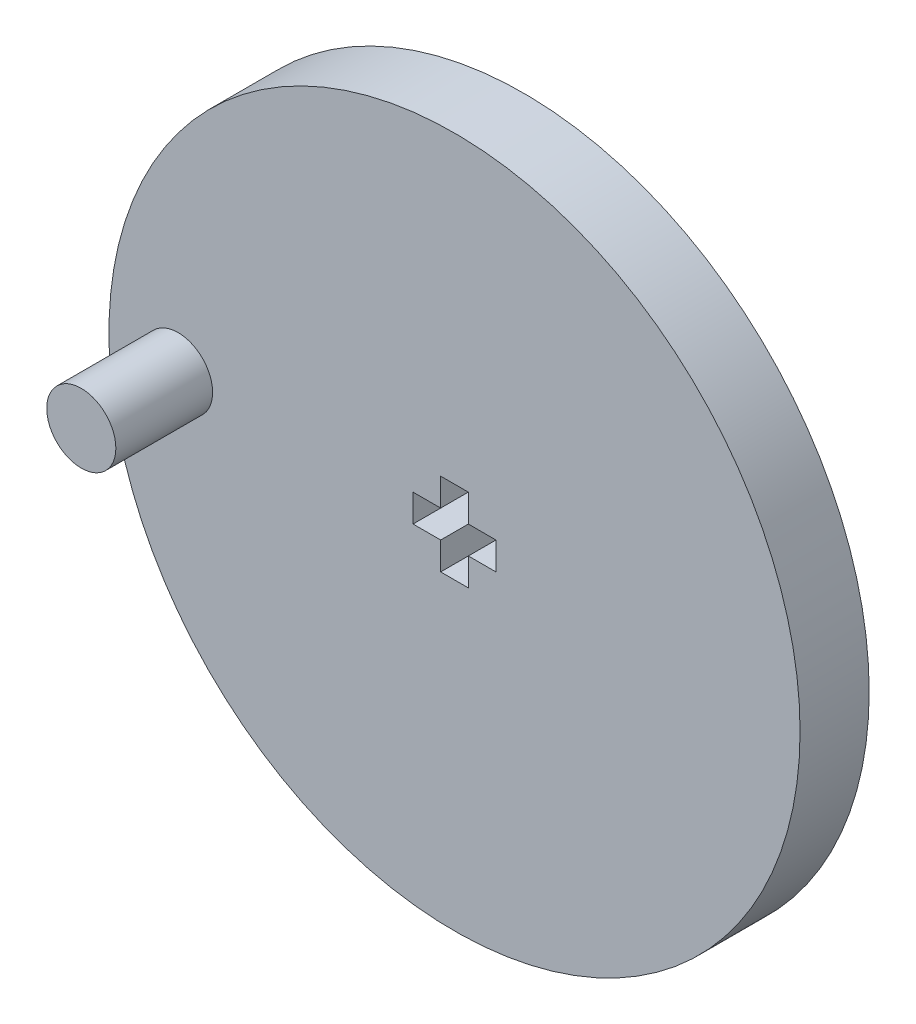
ISO-10303-21;
HEADER;
FILE_DESCRIPTION(('STEP AP214'),'2;1');
FILE_NAME('part.step','',(''),(''),'','','');
FILE_SCHEMA(('AUTOMOTIVE_DESIGN { 1 0 10303 214 1 1 1 1 }'));
ENDSEC;
DATA;
#1=APPLICATION_CONTEXT('core data for automotive mechanical design processes');
#2=APPLICATION_PROTOCOL_DEFINITION('international standard','automotive_design',2000,#1);
#3=PRODUCT_CONTEXT('',#1,'mechanical');
#4=PRODUCT('Part','Part','',(#3));
#5=PRODUCT_RELATED_PRODUCT_CATEGORY('part','',(#4));
#6=PRODUCT_DEFINITION_FORMATION('','',#4);
#7=PRODUCT_DEFINITION_CONTEXT('part definition',#1,'design');
#8=PRODUCT_DEFINITION('design','',#6,#7);
#9=PRODUCT_DEFINITION_SHAPE('','',#8);
#10=(LENGTH_UNIT() NAMED_UNIT(*) SI_UNIT(.MILLI.,.METRE.));
#11=(NAMED_UNIT(*) PLANE_ANGLE_UNIT() SI_UNIT($,.RADIAN.));
#12=(NAMED_UNIT(*) SI_UNIT($,.STERADIAN.) SOLID_ANGLE_UNIT());
#13=UNCERTAINTY_MEASURE_WITH_UNIT(LENGTH_MEASURE(1.E-05),#10,'distance_accuracy_value','');
#14=(GEOMETRIC_REPRESENTATION_CONTEXT(3) GLOBAL_UNCERTAINTY_ASSIGNED_CONTEXT((#13)) GLOBAL_UNIT_ASSIGNED_CONTEXT((#10,
#11,#12)) REPRESENTATION_CONTEXT('',''));
#15=CARTESIAN_POINT('',(0.,0.,0.));
#16=DIRECTION('',(0.,0.,1.));
#17=DIRECTION('',(1.,0.,0.));
#18=AXIS2_PLACEMENT_3D('',#15,#16,#17);
#19=CARTESIAN_POINT('',(0.,0.,5.));
#20=DIRECTION('',(0.,0.,1.));
#21=DIRECTION('',(1.,0.,0.));
#22=AXIS2_PLACEMENT_3D('',#19,#20,#21);
#23=PLANE('',#22);
#24=CARTESIAN_POINT('',(-20.,0.,5.));
#25=DIRECTION('',(0.,0.,1.));
#26=DIRECTION('',(1.,0.,0.));
#27=AXIS2_PLACEMENT_3D('',#24,#25,#26);
#28=CIRCLE('',#27,2.5);
#29=CARTESIAN_POINT('',(-17.5,0.,5.));
#30=VERTEX_POINT('',#29);
#31=EDGE_CURVE('E234',#30,#30,#28,.T.);
#32=ORIENTED_EDGE('',*,*,#31,.F.);
#33=EDGE_LOOP('',(#32));
#34=FACE_BOUND('',#33,.T.);
#35=CARTESIAN_POINT('',(0.,0.,5.));
#36=DIRECTION('',(0.,0.,1.));
#37=DIRECTION('',(1.,0.,0.));
#38=AXIS2_PLACEMENT_3D('',#35,#36,#37);
#39=CIRCLE('',#38,25.);
#40=CARTESIAN_POINT('',(25.,0.,5.));
#41=VERTEX_POINT('',#40);
#42=EDGE_CURVE('E11',#41,#41,#39,.T.);
#43=ORIENTED_EDGE('',*,*,#42,.T.);
#44=EDGE_LOOP('',(#43));
#45=FACE_BOUND('',#44,.T.);
#46=DIRECTION('',(1.,0.,0.));
#47=VECTOR('',#46,1.);
#48=CARTESIAN_POINT('',(0.,3.,5.));
#49=LINE('',#48,#47);
#50=CARTESIAN_POINT('',(-1.,3.,5.));
#51=VERTEX_POINT('',#50);
#52=CARTESIAN_POINT('',(1.,3.,5.));
#53=VERTEX_POINT('',#52);
#54=EDGE_CURVE('E193',#51,#53,#49,.T.);
#55=ORIENTED_EDGE('',*,*,#54,.T.);
#56=DIRECTION('',(0.,-1.,0.));
#57=VECTOR('',#56,1.);
#58=CARTESIAN_POINT('',(1.,0.,5.));
#59=LINE('',#58,#57);
#60=CARTESIAN_POINT('',(1.,1.,5.));
#61=VERTEX_POINT('',#60);
#62=EDGE_CURVE('E55',#53,#61,#59,.T.);
#63=ORIENTED_EDGE('',*,*,#62,.T.);
#64=DIRECTION('',(1.,0.,0.));
#65=VECTOR('',#64,1.);
#66=CARTESIAN_POINT('',(0.,1.,5.));
#67=LINE('',#66,#65);
#68=CARTESIAN_POINT('',(3.,1.,5.));
#69=VERTEX_POINT('',#68);
#70=EDGE_CURVE('E151',#61,#69,#67,.T.);
#71=ORIENTED_EDGE('',*,*,#70,.T.);
#72=DIRECTION('',(0.,-1.,0.));
#73=VECTOR('',#72,1.);
#74=CARTESIAN_POINT('',(3.,0.,5.));
#75=LINE('',#74,#73);
#76=CARTESIAN_POINT('',(3.,-1.,5.));
#77=VERTEX_POINT('',#76);
#78=EDGE_CURVE('E155',#69,#77,#75,.T.);
#79=ORIENTED_EDGE('',*,*,#78,.T.);
#80=DIRECTION('',(1.,0.,0.));
#81=VECTOR('',#80,1.);
#82=CARTESIAN_POINT('',(0.,-1.,5.));
#83=LINE('',#82,#81);
#84=CARTESIAN_POINT('',(1.,-1.,5.));
#85=VERTEX_POINT('',#84);
#86=EDGE_CURVE('E224',#85,#77,#83,.T.);
#87=ORIENTED_EDGE('',*,*,#86,.F.);
#88=DIRECTION('',(0.,-1.,0.));
#89=VECTOR('',#88,1.);
#90=CARTESIAN_POINT('',(1.,0.,5.));
#91=LINE('',#90,#89);
#92=CARTESIAN_POINT('',(1.,-3.,5.));
#93=VERTEX_POINT('',#92);
#94=EDGE_CURVE('E220',#85,#93,#91,.T.);
#95=ORIENTED_EDGE('',*,*,#94,.T.);
#96=DIRECTION('',(1.,0.,0.));
#97=VECTOR('',#96,1.);
#98=CARTESIAN_POINT('',(0.,-3.,5.));
#99=LINE('',#98,#97);
#100=CARTESIAN_POINT('',(-1.,-3.,5.));
#101=VERTEX_POINT('',#100);
#102=EDGE_CURVE('E216',#101,#93,#99,.T.);
#103=ORIENTED_EDGE('',*,*,#102,.F.);
#104=DIRECTION('',(0.,-1.,0.));
#105=VECTOR('',#104,1.);
#106=CARTESIAN_POINT('',(-1.,0.,5.));
#107=LINE('',#106,#105);
#108=CARTESIAN_POINT('',(-1.,-1.,5.));
#109=VERTEX_POINT('',#108);
#110=EDGE_CURVE('E212',#109,#101,#107,.T.);
#111=ORIENTED_EDGE('',*,*,#110,.F.);
#112=DIRECTION('',(1.,0.,0.));
#113=VECTOR('',#112,1.);
#114=CARTESIAN_POINT('',(0.,-1.,5.));
#115=LINE('',#114,#113);
#116=CARTESIAN_POINT('',(-3.,-1.,5.));
#117=VERTEX_POINT('',#116);
#118=EDGE_CURVE('E208',#117,#109,#115,.T.);
#119=ORIENTED_EDGE('',*,*,#118,.F.);
#120=DIRECTION('',(0.,-1.,0.));
#121=VECTOR('',#120,1.);
#122=CARTESIAN_POINT('',(-3.,0.,5.));
#123=LINE('',#122,#121);
#124=CARTESIAN_POINT('',(-3.,1.,5.));
#125=VERTEX_POINT('',#124);
#126=EDGE_CURVE('E204',#125,#117,#123,.T.);
#127=ORIENTED_EDGE('',*,*,#126,.F.);
#128=DIRECTION('',(1.,0.,0.));
#129=VECTOR('',#128,1.);
#130=CARTESIAN_POINT('',(0.,1.,5.));
#131=LINE('',#130,#129);
#132=CARTESIAN_POINT('',(-1.,1.,5.));
#133=VERTEX_POINT('',#132);
#134=EDGE_CURVE('E200',#125,#133,#131,.T.);
#135=ORIENTED_EDGE('',*,*,#134,.T.);
#136=DIRECTION('',(0.,-1.,0.));
#137=VECTOR('',#136,1.);
#138=CARTESIAN_POINT('',(-1.,0.,5.));
#139=LINE('',#138,#137);
#140=EDGE_CURVE('E196',#51,#133,#139,.T.);
#141=ORIENTED_EDGE('',*,*,#140,.F.);
#142=EDGE_LOOP('',(#55,#63,#71,#79,#87,#95,#103,#111,#119,#127,#135,#141));
#143=FACE_BOUND('',#142,.T.);
#144=ADVANCED_FACE('F39',(#34,#45,#143),#23,.T.);
#145=CARTESIAN_POINT('',(0.,0.,0.));
#146=DIRECTION('',(0.,0.,1.));
#147=DIRECTION('',(1.,0.,0.));
#148=AXIS2_PLACEMENT_3D('',#145,#146,#147);
#149=PLANE('',#148);
#150=CARTESIAN_POINT('',(0.,0.,0.));
#151=DIRECTION('',(0.,0.,1.));
#152=DIRECTION('',(1.,0.,0.));
#153=AXIS2_PLACEMENT_3D('',#150,#151,#152);
#154=CIRCLE('',#153,25.);
#155=CARTESIAN_POINT('',(25.,0.,0.));
#156=VERTEX_POINT('',#155);
#157=EDGE_CURVE('E43',#156,#156,#154,.T.);
#158=ORIENTED_EDGE('',*,*,#157,.F.);
#159=EDGE_LOOP('',(#158));
#160=FACE_BOUND('',#159,.T.);
#161=DIRECTION('',(0.,-1.,0.));
#162=VECTOR('',#161,1.);
#163=CARTESIAN_POINT('',(1.,0.,0.));
#164=LINE('',#163,#162);
#165=CARTESIAN_POINT('',(1.,3.,0.));
#166=VERTEX_POINT('',#165);
#167=CARTESIAN_POINT('',(1.,1.,0.));
#168=VERTEX_POINT('',#167);
#169=EDGE_CURVE('E140',#166,#168,#164,.T.);
#170=ORIENTED_EDGE('',*,*,#169,.F.);
#171=DIRECTION('',(1.,0.,0.));
#172=VECTOR('',#171,1.);
#173=CARTESIAN_POINT('',(0.,3.,0.));
#174=LINE('',#173,#172);
#175=CARTESIAN_POINT('',(-1.,3.,0.));
#176=VERTEX_POINT('',#175);
#177=EDGE_CURVE('E131',#176,#166,#174,.T.);
#178=ORIENTED_EDGE('',*,*,#177,.F.);
#179=DIRECTION('',(0.,-1.,0.));
#180=VECTOR('',#179,1.);
#181=CARTESIAN_POINT('',(-1.,0.,0.));
#182=LINE('',#181,#180);
#183=CARTESIAN_POINT('',(-1.,1.,0.));
#184=VERTEX_POINT('',#183);
#185=EDGE_CURVE('E63',#176,#184,#182,.T.);
#186=ORIENTED_EDGE('',*,*,#185,.T.);
#187=DIRECTION('',(1.,0.,0.));
#188=VECTOR('',#187,1.);
#189=CARTESIAN_POINT('',(0.,1.,0.));
#190=LINE('',#189,#188);
#191=CARTESIAN_POINT('',(-3.,1.,0.));
#192=VERTEX_POINT('',#191);
#193=EDGE_CURVE('E160',#192,#184,#190,.T.);
#194=ORIENTED_EDGE('',*,*,#193,.F.);
#195=DIRECTION('',(0.,-1.,0.));
#196=VECTOR('',#195,1.);
#197=CARTESIAN_POINT('',(-3.,0.,0.));
#198=LINE('',#197,#196);
#199=CARTESIAN_POINT('',(-3.,-1.,0.));
#200=VERTEX_POINT('',#199);
#201=EDGE_CURVE('E163',#192,#200,#198,.T.);
#202=ORIENTED_EDGE('',*,*,#201,.T.);
#203=DIRECTION('',(1.,0.,0.));
#204=VECTOR('',#203,1.);
#205=CARTESIAN_POINT('',(0.,-1.,0.));
#206=LINE('',#205,#204);
#207=CARTESIAN_POINT('',(-1.,-1.,0.));
#208=VERTEX_POINT('',#207);
#209=EDGE_CURVE('E167',#200,#208,#206,.T.);
#210=ORIENTED_EDGE('',*,*,#209,.T.);
#211=DIRECTION('',(0.,-1.,0.));
#212=VECTOR('',#211,1.);
#213=CARTESIAN_POINT('',(-1.,0.,0.));
#214=LINE('',#213,#212);
#215=CARTESIAN_POINT('',(-1.,-3.,0.));
#216=VERTEX_POINT('',#215);
#217=EDGE_CURVE('E171',#208,#216,#214,.T.);
#218=ORIENTED_EDGE('',*,*,#217,.T.);
#219=DIRECTION('',(1.,0.,0.));
#220=VECTOR('',#219,1.);
#221=CARTESIAN_POINT('',(0.,-3.,0.));
#222=LINE('',#221,#220);
#223=CARTESIAN_POINT('',(1.,-3.,0.));
#224=VERTEX_POINT('',#223);
#225=EDGE_CURVE('E175',#216,#224,#222,.T.);
#226=ORIENTED_EDGE('',*,*,#225,.T.);
#227=DIRECTION('',(0.,-1.,0.));
#228=VECTOR('',#227,1.);
#229=CARTESIAN_POINT('',(1.,0.,0.));
#230=LINE('',#229,#228);
#231=CARTESIAN_POINT('',(1.,-1.,0.));
#232=VERTEX_POINT('',#231);
#233=EDGE_CURVE('E179',#232,#224,#230,.T.);
#234=ORIENTED_EDGE('',*,*,#233,.F.);
#235=DIRECTION('',(1.,0.,0.));
#236=VECTOR('',#235,1.);
#237=CARTESIAN_POINT('',(0.,-1.,0.));
#238=LINE('',#237,#236);
#239=CARTESIAN_POINT('',(3.,-1.,0.));
#240=VERTEX_POINT('',#239);
#241=EDGE_CURVE('E182',#232,#240,#238,.T.);
#242=ORIENTED_EDGE('',*,*,#241,.T.);
#243=DIRECTION('',(0.,-1.,0.));
#244=VECTOR('',#243,1.);
#245=CARTESIAN_POINT('',(3.,0.,0.));
#246=LINE('',#245,#244);
#247=CARTESIAN_POINT('',(3.,1.,0.));
#248=VERTEX_POINT('',#247);
#249=EDGE_CURVE('E186',#248,#240,#246,.T.);
#250=ORIENTED_EDGE('',*,*,#249,.F.);
#251=DIRECTION('',(1.,0.,0.));
#252=VECTOR('',#251,1.);
#253=CARTESIAN_POINT('',(0.,1.,0.));
#254=LINE('',#253,#252);
#255=EDGE_CURVE('E145',#168,#248,#254,.T.);
#256=ORIENTED_EDGE('',*,*,#255,.F.);
#257=EDGE_LOOP('',(#170,#178,#186,#194,#202,#210,#218,#226,#234,#242,#250,#256));
#258=FACE_BOUND('',#257,.T.);
#259=ADVANCED_FACE('F148',(#160,#258),#149,.F.);
#260=CARTESIAN_POINT('',(0.,0.,5.));
#261=DIRECTION('',(0.,0.,-1.));
#262=DIRECTION('',(-1.,0.,0.));
#263=AXIS2_PLACEMENT_3D('',#260,#261,#262);
#264=CYLINDRICAL_SURFACE('',#263,25.);
#265=ORIENTED_EDGE('',*,*,#42,.F.);
#266=EDGE_LOOP('',(#265));
#267=FACE_BOUND('',#266,.T.);
#268=ORIENTED_EDGE('',*,*,#157,.T.);
#269=EDGE_LOOP('',(#268));
#270=FACE_BOUND('',#269,.T.);
#271=ADVANCED_FACE('F41',(#267,#270),#264,.T.);
#272=CARTESIAN_POINT('',(-20.,0.,12.));
#273=DIRECTION('',(0.,0.,-1.));
#274=DIRECTION('',(-1.,0.,0.));
#275=AXIS2_PLACEMENT_3D('',#272,#273,#274);
#276=CYLINDRICAL_SURFACE('',#275,2.5);
#277=CARTESIAN_POINT('',(-20.,0.,12.));
#278=DIRECTION('',(0.,0.,1.));
#279=DIRECTION('',(1.,0.,0.));
#280=AXIS2_PLACEMENT_3D('',#277,#278,#279);
#281=CIRCLE('',#280,2.5);
#282=CARTESIAN_POINT('',(-17.5,0.,12.));
#283=VERTEX_POINT('',#282);
#284=EDGE_CURVE('E264',#283,#283,#281,.T.);
#285=ORIENTED_EDGE('',*,*,#284,.F.);
#286=EDGE_LOOP('',(#285));
#287=FACE_BOUND('',#286,.T.);
#288=ORIENTED_EDGE('',*,*,#31,.T.);
#289=EDGE_LOOP('',(#288));
#290=FACE_BOUND('',#289,.T.);
#291=ADVANCED_FACE('F272',(#287,#290),#276,.T.);
#292=CARTESIAN_POINT('',(-20.,0.,12.));
#293=DIRECTION('',(0.,0.,1.));
#294=DIRECTION('',(1.,0.,0.));
#295=AXIS2_PLACEMENT_3D('',#292,#293,#294);
#296=PLANE('',#295);
#297=ORIENTED_EDGE('',*,*,#284,.T.);
#298=EDGE_LOOP('',(#297));
#299=FACE_BOUND('',#298,.T.);
#300=ADVANCED_FACE('F324',(#299),#296,.T.);
#301=CARTESIAN_POINT('',(1.,0.,0.));
#302=DIRECTION('',(-1.,0.,0.));
#303=DIRECTION('',(0.,0.,1.));
#304=AXIS2_PLACEMENT_3D('',#301,#302,#303);
#305=PLANE('',#304);
#306=ORIENTED_EDGE('',*,*,#62,.F.);
#307=DIRECTION('',(0.,0.,1.));
#308=VECTOR('',#307,1.);
#309=CARTESIAN_POINT('',(1.,3.,0.));
#310=LINE('',#309,#308);
#311=EDGE_CURVE('E134',#166,#53,#310,.T.);
#312=ORIENTED_EDGE('',*,*,#311,.F.);
#313=ORIENTED_EDGE('',*,*,#169,.T.);
#314=DIRECTION('',(0.,0.,1.));
#315=VECTOR('',#314,1.);
#316=CARTESIAN_POINT('',(1.,1.,0.));
#317=LINE('',#316,#315);
#318=EDGE_CURVE('E231',#168,#61,#317,.T.);
#319=ORIENTED_EDGE('',*,*,#318,.T.);
#320=EDGE_LOOP('',(#306,#312,#313,#319));
#321=FACE_BOUND('',#320,.T.);
#322=ADVANCED_FACE('F142',(#321),#305,.T.);
#323=CARTESIAN_POINT('',(0.,1.,0.));
#324=DIRECTION('',(0.,-1.,0.));
#325=DIRECTION('',(0.,0.,-1.));
#326=AXIS2_PLACEMENT_3D('',#323,#324,#325);
#327=PLANE('',#326);
#328=ORIENTED_EDGE('',*,*,#70,.F.);
#329=ORIENTED_EDGE('',*,*,#318,.F.);
#330=ORIENTED_EDGE('',*,*,#255,.T.);
#331=DIRECTION('',(0.,0.,1.));
#332=VECTOR('',#331,1.);
#333=CARTESIAN_POINT('',(3.,1.,0.));
#334=LINE('',#333,#332);
#335=EDGE_CURVE('E235',#248,#69,#334,.T.);
#336=ORIENTED_EDGE('',*,*,#335,.T.);
#337=EDGE_LOOP('',(#328,#329,#330,#336));
#338=FACE_BOUND('',#337,.T.);
#339=ADVANCED_FACE('F316',(#338),#327,.T.);
#340=CARTESIAN_POINT('',(3.,0.,0.));
#341=DIRECTION('',(-1.,0.,0.));
#342=DIRECTION('',(0.,0.,1.));
#343=AXIS2_PLACEMENT_3D('',#340,#341,#342);
#344=PLANE('',#343);
#345=ORIENTED_EDGE('',*,*,#78,.F.);
#346=ORIENTED_EDGE('',*,*,#335,.F.);
#347=ORIENTED_EDGE('',*,*,#249,.T.);
#348=DIRECTION('',(0.,0.,1.));
#349=VECTOR('',#348,1.);
#350=CARTESIAN_POINT('',(3.,-1.,0.));
#351=LINE('',#350,#349);
#352=EDGE_CURVE('E238',#240,#77,#351,.T.);
#353=ORIENTED_EDGE('',*,*,#352,.T.);
#354=EDGE_LOOP('',(#345,#346,#347,#353));
#355=FACE_BOUND('',#354,.T.);
#356=ADVANCED_FACE('F313',(#355),#344,.T.);
#357=CARTESIAN_POINT('',(0.,-1.,0.));
#358=DIRECTION('',(0.,-1.,0.));
#359=DIRECTION('',(0.,0.,-1.));
#360=AXIS2_PLACEMENT_3D('',#357,#358,#359);
#361=PLANE('',#360);
#362=ORIENTED_EDGE('',*,*,#86,.T.);
#363=ORIENTED_EDGE('',*,*,#352,.F.);
#364=ORIENTED_EDGE('',*,*,#241,.F.);
#365=DIRECTION('',(0.,0.,1.));
#366=VECTOR('',#365,1.);
#367=CARTESIAN_POINT('',(1.,-1.,0.));
#368=LINE('',#367,#366);
#369=EDGE_CURVE('E241',#232,#85,#368,.T.);
#370=ORIENTED_EDGE('',*,*,#369,.T.);
#371=EDGE_LOOP('',(#362,#363,#364,#370));
#372=FACE_BOUND('',#371,.T.);
#373=ADVANCED_FACE('F310',(#372),#361,.F.);
#374=CARTESIAN_POINT('',(1.,0.,0.));
#375=DIRECTION('',(-1.,0.,0.));
#376=DIRECTION('',(0.,0.,1.));
#377=AXIS2_PLACEMENT_3D('',#374,#375,#376);
#378=PLANE('',#377);
#379=ORIENTED_EDGE('',*,*,#94,.F.);
#380=ORIENTED_EDGE('',*,*,#369,.F.);
#381=ORIENTED_EDGE('',*,*,#233,.T.);
#382=DIRECTION('',(0.,0.,1.));
#383=VECTOR('',#382,1.);
#384=CARTESIAN_POINT('',(1.,-3.,0.));
#385=LINE('',#384,#383);
#386=EDGE_CURVE('E244',#224,#93,#385,.T.);
#387=ORIENTED_EDGE('',*,*,#386,.T.);
#388=EDGE_LOOP('',(#379,#380,#381,#387));
#389=FACE_BOUND('',#388,.T.);
#390=ADVANCED_FACE('F305',(#389),#378,.T.);
#391=CARTESIAN_POINT('',(0.,-3.,0.));
#392=DIRECTION('',(0.,-1.,0.));
#393=DIRECTION('',(0.,0.,-1.));
#394=AXIS2_PLACEMENT_3D('',#391,#392,#393);
#395=PLANE('',#394);
#396=ORIENTED_EDGE('',*,*,#102,.T.);
#397=ORIENTED_EDGE('',*,*,#386,.F.);
#398=ORIENTED_EDGE('',*,*,#225,.F.);
#399=DIRECTION('',(0.,0.,1.));
#400=VECTOR('',#399,1.);
#401=CARTESIAN_POINT('',(-1.,-3.,0.));
#402=LINE('',#401,#400);
#403=EDGE_CURVE('E247',#216,#101,#402,.T.);
#404=ORIENTED_EDGE('',*,*,#403,.T.);
#405=EDGE_LOOP('',(#396,#397,#398,#404));
#406=FACE_BOUND('',#405,.T.);
#407=ADVANCED_FACE('F302',(#406),#395,.F.);
#408=CARTESIAN_POINT('',(-1.,0.,0.));
#409=DIRECTION('',(-1.,0.,0.));
#410=DIRECTION('',(0.,0.,1.));
#411=AXIS2_PLACEMENT_3D('',#408,#409,#410);
#412=PLANE('',#411);
#413=ORIENTED_EDGE('',*,*,#110,.T.);
#414=ORIENTED_EDGE('',*,*,#403,.F.);
#415=ORIENTED_EDGE('',*,*,#217,.F.);
#416=DIRECTION('',(0.,0.,1.));
#417=VECTOR('',#416,1.);
#418=CARTESIAN_POINT('',(-1.,-1.,0.));
#419=LINE('',#418,#417);
#420=EDGE_CURVE('E250',#208,#109,#419,.T.);
#421=ORIENTED_EDGE('',*,*,#420,.T.);
#422=EDGE_LOOP('',(#413,#414,#415,#421));
#423=FACE_BOUND('',#422,.T.);
#424=ADVANCED_FACE('F297',(#423),#412,.F.);
#425=CARTESIAN_POINT('',(0.,-1.,0.));
#426=DIRECTION('',(0.,-1.,0.));
#427=DIRECTION('',(0.,0.,-1.));
#428=AXIS2_PLACEMENT_3D('',#425,#426,#427);
#429=PLANE('',#428);
#430=ORIENTED_EDGE('',*,*,#118,.T.);
#431=ORIENTED_EDGE('',*,*,#420,.F.);
#432=ORIENTED_EDGE('',*,*,#209,.F.);
#433=DIRECTION('',(0.,0.,1.));
#434=VECTOR('',#433,1.);
#435=CARTESIAN_POINT('',(-3.,-1.,0.));
#436=LINE('',#435,#434);
#437=EDGE_CURVE('E253',#200,#117,#436,.T.);
#438=ORIENTED_EDGE('',*,*,#437,.T.);
#439=EDGE_LOOP('',(#430,#431,#432,#438));
#440=FACE_BOUND('',#439,.T.);
#441=ADVANCED_FACE('F292',(#440),#429,.F.);
#442=CARTESIAN_POINT('',(-3.,0.,0.));
#443=DIRECTION('',(-1.,0.,0.));
#444=DIRECTION('',(0.,0.,1.));
#445=AXIS2_PLACEMENT_3D('',#442,#443,#444);
#446=PLANE('',#445);
#447=ORIENTED_EDGE('',*,*,#126,.T.);
#448=ORIENTED_EDGE('',*,*,#437,.F.);
#449=ORIENTED_EDGE('',*,*,#201,.F.);
#450=DIRECTION('',(0.,0.,1.));
#451=VECTOR('',#450,1.);
#452=CARTESIAN_POINT('',(-3.,1.,0.));
#453=LINE('',#452,#451);
#454=EDGE_CURVE('E256',#192,#125,#453,.T.);
#455=ORIENTED_EDGE('',*,*,#454,.T.);
#456=EDGE_LOOP('',(#447,#448,#449,#455));
#457=FACE_BOUND('',#456,.T.);
#458=ADVANCED_FACE('F288',(#457),#446,.F.);
#459=CARTESIAN_POINT('',(0.,1.,0.));
#460=DIRECTION('',(0.,-1.,0.));
#461=DIRECTION('',(0.,0.,-1.));
#462=AXIS2_PLACEMENT_3D('',#459,#460,#461);
#463=PLANE('',#462);
#464=ORIENTED_EDGE('',*,*,#134,.F.);
#465=ORIENTED_EDGE('',*,*,#454,.F.);
#466=ORIENTED_EDGE('',*,*,#193,.T.);
#467=DIRECTION('',(0.,0.,1.));
#468=VECTOR('',#467,1.);
#469=CARTESIAN_POINT('',(-1.,1.,0.));
#470=LINE('',#469,#468);
#471=EDGE_CURVE('E259',#184,#133,#470,.T.);
#472=ORIENTED_EDGE('',*,*,#471,.T.);
#473=EDGE_LOOP('',(#464,#465,#466,#472));
#474=FACE_BOUND('',#473,.T.);
#475=ADVANCED_FACE('F286',(#474),#463,.T.);
#476=CARTESIAN_POINT('',(-1.,0.,0.));
#477=DIRECTION('',(-1.,0.,0.));
#478=DIRECTION('',(0.,0.,1.));
#479=AXIS2_PLACEMENT_3D('',#476,#477,#478);
#480=PLANE('',#479);
#481=ORIENTED_EDGE('',*,*,#140,.T.);
#482=ORIENTED_EDGE('',*,*,#471,.F.);
#483=ORIENTED_EDGE('',*,*,#185,.F.);
#484=DIRECTION('',(0.,0.,1.));
#485=VECTOR('',#484,1.);
#486=CARTESIAN_POINT('',(-1.,3.,0.));
#487=LINE('',#486,#485);
#488=EDGE_CURVE('E136',#176,#51,#487,.T.);
#489=ORIENTED_EDGE('',*,*,#488,.T.);
#490=EDGE_LOOP('',(#481,#482,#483,#489));
#491=FACE_BOUND('',#490,.T.);
#492=ADVANCED_FACE('F282',(#491),#480,.F.);
#493=CARTESIAN_POINT('',(0.,3.,0.));
#494=DIRECTION('',(0.,-1.,0.));
#495=DIRECTION('',(0.,0.,-1.));
#496=AXIS2_PLACEMENT_3D('',#493,#494,#495);
#497=PLANE('',#496);
#498=ORIENTED_EDGE('',*,*,#54,.F.);
#499=ORIENTED_EDGE('',*,*,#488,.F.);
#500=ORIENTED_EDGE('',*,*,#177,.T.);
#501=ORIENTED_EDGE('',*,*,#311,.T.);
#502=EDGE_LOOP('',(#498,#499,#500,#501));
#503=FACE_BOUND('',#502,.T.);
#504=ADVANCED_FACE('F133',(#503),#497,.T.);
#505=CLOSED_SHELL('',(#144,#259,#271,#291,#300,#322,#339,#356,#373,#390,#407,#424,#441,#458,
#475,#492,#504));
#506=MANIFOLD_SOLID_BREP('B2',#505);
#507=ADVANCED_BREP_SHAPE_REPRESENTATION('',(#18,#506),#14);
#508=SHAPE_DEFINITION_REPRESENTATION(#9,#507);
ENDSEC;
END-ISO-10303-21;
